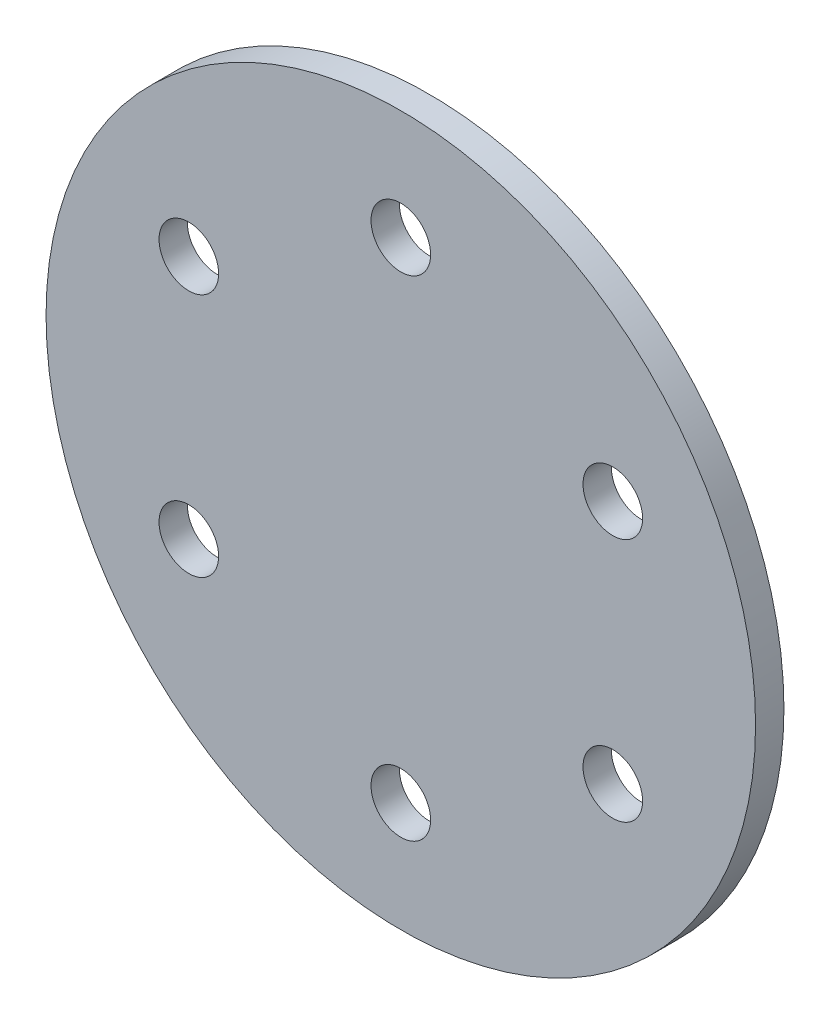
ISO-10303-21;
HEADER;
FILE_DESCRIPTION(('STEP AP214'),'2;1');
FILE_NAME('part.step','',(''),(''),'','','');
FILE_SCHEMA(('AUTOMOTIVE_DESIGN { 1 0 10303 214 1 1 1 1 }'));
ENDSEC;
DATA;
#1=APPLICATION_CONTEXT('core data for automotive mechanical design processes');
#2=APPLICATION_PROTOCOL_DEFINITION('international standard','automotive_design',2000,#1);
#3=PRODUCT_CONTEXT('',#1,'mechanical');
#4=PRODUCT('Part','Part','',(#3));
#5=PRODUCT_RELATED_PRODUCT_CATEGORY('part','',(#4));
#6=PRODUCT_DEFINITION_FORMATION('','',#4);
#7=PRODUCT_DEFINITION_CONTEXT('part definition',#1,'design');
#8=PRODUCT_DEFINITION('design','',#6,#7);
#9=PRODUCT_DEFINITION_SHAPE('','',#8);
#10=(LENGTH_UNIT() NAMED_UNIT(*) SI_UNIT(.MILLI.,.METRE.));
#11=(NAMED_UNIT(*) PLANE_ANGLE_UNIT() SI_UNIT($,.RADIAN.));
#12=(NAMED_UNIT(*) SI_UNIT($,.STERADIAN.) SOLID_ANGLE_UNIT());
#13=UNCERTAINTY_MEASURE_WITH_UNIT(LENGTH_MEASURE(1.E-05),#10,'distance_accuracy_value','');
#14=(GEOMETRIC_REPRESENTATION_CONTEXT(3) GLOBAL_UNCERTAINTY_ASSIGNED_CONTEXT((#13)) GLOBAL_UNIT_ASSIGNED_CONTEXT((#10,
#11,#12)) REPRESENTATION_CONTEXT('',''));
#15=CARTESIAN_POINT('',(0.,0.,0.));
#16=DIRECTION('',(0.,0.,1.));
#17=DIRECTION('',(1.,0.,0.));
#18=AXIS2_PLACEMENT_3D('',#15,#16,#17);
#19=CARTESIAN_POINT('',(0.,0.,2.));
#20=DIRECTION('',(0.,0.,1.));
#21=DIRECTION('',(1.,0.,0.));
#22=AXIS2_PLACEMENT_3D('',#19,#20,#21);
#23=PLANE('',#22);
#24=CARTESIAN_POINT('',(-14.9389382152805,-8.62500000000064,2.));
#25=DIRECTION('',(0.,0.,1.));
#26=DIRECTION('',(1.,0.,0.));
#27=AXIS2_PLACEMENT_3D('',#24,#25,#26);
#28=CIRCLE('',#27,2.1);
#29=CARTESIAN_POINT('',(-12.8389382152805,-8.62500000000064,2.));
#30=VERTEX_POINT('',#29);
#31=EDGE_CURVE('E69',#30,#30,#28,.T.);
#32=ORIENTED_EDGE('',*,*,#31,.F.);
#33=EDGE_LOOP('',(#32));
#34=FACE_BOUND('',#33,.T.);
#35=CARTESIAN_POINT('',(14.9389382152827,-8.62499999999937,2.));
#36=DIRECTION('',(0.,0.,1.));
#37=DIRECTION('',(1.,0.,0.));
#38=AXIS2_PLACEMENT_3D('',#35,#36,#37);
#39=CIRCLE('',#38,2.1);
#40=CARTESIAN_POINT('',(17.0389382152827,-8.62499999999937,2.));
#41=VERTEX_POINT('',#40);
#42=EDGE_CURVE('E57',#41,#41,#39,.T.);
#43=ORIENTED_EDGE('',*,*,#42,.F.);
#44=EDGE_LOOP('',(#43));
#45=FACE_BOUND('',#44,.T.);
#46=CARTESIAN_POINT('',(0.,17.25,2.));
#47=DIRECTION('',(0.,0.,1.));
#48=DIRECTION('',(1.,0.,0.));
#49=AXIS2_PLACEMENT_3D('',#46,#47,#48);
#50=CIRCLE('',#49,2.1);
#51=CARTESIAN_POINT('',(2.1,17.25,2.));
#52=VERTEX_POINT('',#51);
#53=EDGE_CURVE('E46',#52,#52,#50,.T.);
#54=ORIENTED_EDGE('',*,*,#53,.F.);
#55=EDGE_LOOP('',(#54));
#56=FACE_BOUND('',#55,.T.);
#57=CARTESIAN_POINT('',(0.,0.,2.));
#58=DIRECTION('',(0.,0.,1.));
#59=DIRECTION('',(1.,0.,0.));
#60=AXIS2_PLACEMENT_3D('',#57,#58,#59);
#61=CIRCLE('',#60,25.);
#62=CARTESIAN_POINT('',(25.,0.,2.));
#63=VERTEX_POINT('',#62);
#64=EDGE_CURVE('E10',#63,#63,#61,.T.);
#65=ORIENTED_EDGE('',*,*,#64,.T.);
#66=EDGE_LOOP('',(#65));
#67=FACE_BOUND('',#66,.T.);
#68=CARTESIAN_POINT('',(14.9389382152819,8.62500000000064,2.));
#69=DIRECTION('',(0.,0.,1.));
#70=DIRECTION('',(1.,0.,0.));
#71=AXIS2_PLACEMENT_3D('',#68,#69,#70);
#72=CIRCLE('',#71,2.1);
#73=CARTESIAN_POINT('',(17.0389382152819,8.62500000000064,2.));
#74=VERTEX_POINT('',#73);
#75=EDGE_CURVE('E51',#74,#74,#72,.T.);
#76=ORIENTED_EDGE('',*,*,#75,.F.);
#77=EDGE_LOOP('',(#76));
#78=FACE_BOUND('',#77,.T.);
#79=CARTESIAN_POINT('',(1.46448591583782E-12,-17.25,2.));
#80=DIRECTION('',(0.,0.,1.));
#81=DIRECTION('',(1.,0.,0.));
#82=AXIS2_PLACEMENT_3D('',#79,#80,#81);
#83=CIRCLE('',#82,2.1);
#84=CARTESIAN_POINT('',(2.10000000000147,-17.25,2.));
#85=VERTEX_POINT('',#84);
#86=EDGE_CURVE('E63',#85,#85,#83,.T.);
#87=ORIENTED_EDGE('',*,*,#86,.F.);
#88=EDGE_LOOP('',(#87));
#89=FACE_BOUND('',#88,.T.);
#90=CARTESIAN_POINT('',(-14.9389382152812,8.62499999999936,2.));
#91=DIRECTION('',(0.,0.,1.));
#92=DIRECTION('',(1.,0.,0.));
#93=AXIS2_PLACEMENT_3D('',#90,#91,#92);
#94=CIRCLE('',#93,2.1);
#95=CARTESIAN_POINT('',(-12.8389382152812,8.62499999999936,2.));
#96=VERTEX_POINT('',#95);
#97=EDGE_CURVE('E75',#96,#96,#94,.T.);
#98=ORIENTED_EDGE('',*,*,#97,.F.);
#99=EDGE_LOOP('',(#98));
#100=FACE_BOUND('',#99,.T.);
#101=ADVANCED_FACE('F35',(#34,#45,#56,#67,#78,#89,#100),#23,.T.);
#102=CARTESIAN_POINT('',(0.,0.,0.));
#103=DIRECTION('',(0.,0.,1.));
#104=DIRECTION('',(1.,0.,0.));
#105=AXIS2_PLACEMENT_3D('',#102,#103,#104);
#106=PLANE('',#105);
#107=CARTESIAN_POINT('',(0.,0.,0.));
#108=DIRECTION('',(0.,0.,1.));
#109=DIRECTION('',(1.,0.,0.));
#110=AXIS2_PLACEMENT_3D('',#107,#108,#109);
#111=CIRCLE('',#110,25.);
#112=CARTESIAN_POINT('',(25.,0.,0.));
#113=VERTEX_POINT('',#112);
#114=EDGE_CURVE('E39',#113,#113,#111,.T.);
#115=ORIENTED_EDGE('',*,*,#114,.F.);
#116=EDGE_LOOP('',(#115));
#117=FACE_BOUND('',#116,.T.);
#118=CARTESIAN_POINT('',(0.,17.25,0.));
#119=DIRECTION('',(0.,0.,1.));
#120=DIRECTION('',(1.,0.,0.));
#121=AXIS2_PLACEMENT_3D('',#118,#119,#120);
#122=CIRCLE('',#121,2.1);
#123=CARTESIAN_POINT('',(2.1,17.25,0.));
#124=VERTEX_POINT('',#123);
#125=EDGE_CURVE('E48',#124,#124,#122,.T.);
#126=ORIENTED_EDGE('',*,*,#125,.T.);
#127=EDGE_LOOP('',(#126));
#128=FACE_BOUND('',#127,.T.);
#129=CARTESIAN_POINT('',(14.9389382152819,8.62500000000064,0.));
#130=DIRECTION('',(0.,0.,1.));
#131=DIRECTION('',(1.,0.,0.));
#132=AXIS2_PLACEMENT_3D('',#129,#130,#131);
#133=CIRCLE('',#132,2.1);
#134=CARTESIAN_POINT('',(17.0389382152819,8.62500000000064,0.));
#135=VERTEX_POINT('',#134);
#136=EDGE_CURVE('E54',#135,#135,#133,.T.);
#137=ORIENTED_EDGE('',*,*,#136,.T.);
#138=EDGE_LOOP('',(#137));
#139=FACE_BOUND('',#138,.T.);
#140=CARTESIAN_POINT('',(14.9389382152827,-8.62499999999937,0.));
#141=DIRECTION('',(0.,0.,1.));
#142=DIRECTION('',(1.,0.,0.));
#143=AXIS2_PLACEMENT_3D('',#140,#141,#142);
#144=CIRCLE('',#143,2.1);
#145=CARTESIAN_POINT('',(17.0389382152827,-8.62499999999937,0.));
#146=VERTEX_POINT('',#145);
#147=EDGE_CURVE('E60',#146,#146,#144,.T.);
#148=ORIENTED_EDGE('',*,*,#147,.T.);
#149=EDGE_LOOP('',(#148));
#150=FACE_BOUND('',#149,.T.);
#151=CARTESIAN_POINT('',(1.46448591583782E-12,-17.25,0.));
#152=DIRECTION('',(0.,0.,1.));
#153=DIRECTION('',(1.,0.,0.));
#154=AXIS2_PLACEMENT_3D('',#151,#152,#153);
#155=CIRCLE('',#154,2.1);
#156=CARTESIAN_POINT('',(2.10000000000147,-17.25,0.));
#157=VERTEX_POINT('',#156);
#158=EDGE_CURVE('E66',#157,#157,#155,.T.);
#159=ORIENTED_EDGE('',*,*,#158,.T.);
#160=EDGE_LOOP('',(#159));
#161=FACE_BOUND('',#160,.T.);
#162=CARTESIAN_POINT('',(-14.9389382152805,-8.62500000000064,0.));
#163=DIRECTION('',(0.,0.,1.));
#164=DIRECTION('',(1.,0.,0.));
#165=AXIS2_PLACEMENT_3D('',#162,#163,#164);
#166=CIRCLE('',#165,2.1);
#167=CARTESIAN_POINT('',(-12.8389382152805,-8.62500000000064,0.));
#168=VERTEX_POINT('',#167);
#169=EDGE_CURVE('E72',#168,#168,#166,.T.);
#170=ORIENTED_EDGE('',*,*,#169,.T.);
#171=EDGE_LOOP('',(#170));
#172=FACE_BOUND('',#171,.T.);
#173=CARTESIAN_POINT('',(-14.9389382152812,8.62499999999936,0.));
#174=DIRECTION('',(0.,0.,1.));
#175=DIRECTION('',(1.,0.,0.));
#176=AXIS2_PLACEMENT_3D('',#173,#174,#175);
#177=CIRCLE('',#176,2.1);
#178=CARTESIAN_POINT('',(-12.8389382152812,8.62499999999936,0.));
#179=VERTEX_POINT('',#178);
#180=EDGE_CURVE('E78',#179,#179,#177,.T.);
#181=ORIENTED_EDGE('',*,*,#180,.T.);
#182=EDGE_LOOP('',(#181));
#183=FACE_BOUND('',#182,.T.);
#184=ADVANCED_FACE('F88',(#117,#128,#139,#150,#161,#172,#183),#106,.F.);
#185=CARTESIAN_POINT('',(0.,0.,2.));
#186=DIRECTION('',(0.,0.,-1.));
#187=DIRECTION('',(-1.,0.,0.));
#188=AXIS2_PLACEMENT_3D('',#185,#186,#187);
#189=CYLINDRICAL_SURFACE('',#188,25.);
#190=ORIENTED_EDGE('',*,*,#64,.F.);
#191=EDGE_LOOP('',(#190));
#192=FACE_BOUND('',#191,.T.);
#193=ORIENTED_EDGE('',*,*,#114,.T.);
#194=EDGE_LOOP('',(#193));
#195=FACE_BOUND('',#194,.T.);
#196=ADVANCED_FACE('F37',(#192,#195),#189,.T.);
#197=CARTESIAN_POINT('',(0.,17.25,2.));
#198=DIRECTION('',(0.,0.,-1.));
#199=DIRECTION('',(-1.,0.,0.));
#200=AXIS2_PLACEMENT_3D('',#197,#198,#199);
#201=CYLINDRICAL_SURFACE('',#200,2.1);
#202=ORIENTED_EDGE('',*,*,#53,.T.);
#203=EDGE_LOOP('',(#202));
#204=FACE_BOUND('',#203,.T.);
#205=ORIENTED_EDGE('',*,*,#125,.F.);
#206=EDGE_LOOP('',(#205));
#207=FACE_BOUND('',#206,.T.);
#208=ADVANCED_FACE('F98',(#204,#207),#201,.F.);
#209=CARTESIAN_POINT('',(14.9389382152819,8.62500000000064,2.));
#210=DIRECTION('',(0.,0.,-1.));
#211=DIRECTION('',(-1.,0.,0.));
#212=AXIS2_PLACEMENT_3D('',#209,#210,#211);
#213=CYLINDRICAL_SURFACE('',#212,2.1);
#214=ORIENTED_EDGE('',*,*,#75,.T.);
#215=EDGE_LOOP('',(#214));
#216=FACE_BOUND('',#215,.T.);
#217=ORIENTED_EDGE('',*,*,#136,.F.);
#218=EDGE_LOOP('',(#217));
#219=FACE_BOUND('',#218,.T.);
#220=ADVANCED_FACE('F101',(#216,#219),#213,.F.);
#221=CARTESIAN_POINT('',(14.9389382152827,-8.62499999999937,2.));
#222=DIRECTION('',(0.,0.,-1.));
#223=DIRECTION('',(-1.,0.,0.));
#224=AXIS2_PLACEMENT_3D('',#221,#222,#223);
#225=CYLINDRICAL_SURFACE('',#224,2.1);
#226=ORIENTED_EDGE('',*,*,#42,.T.);
#227=EDGE_LOOP('',(#226));
#228=FACE_BOUND('',#227,.T.);
#229=ORIENTED_EDGE('',*,*,#147,.F.);
#230=EDGE_LOOP('',(#229));
#231=FACE_BOUND('',#230,.T.);
#232=ADVANCED_FACE('F105',(#228,#231),#225,.F.);
#233=CARTESIAN_POINT('',(1.46448591583782E-12,-17.25,2.));
#234=DIRECTION('',(0.,0.,-1.));
#235=DIRECTION('',(-1.,0.,0.));
#236=AXIS2_PLACEMENT_3D('',#233,#234,#235);
#237=CYLINDRICAL_SURFACE('',#236,2.1);
#238=ORIENTED_EDGE('',*,*,#86,.T.);
#239=EDGE_LOOP('',(#238));
#240=FACE_BOUND('',#239,.T.);
#241=ORIENTED_EDGE('',*,*,#158,.F.);
#242=EDGE_LOOP('',(#241));
#243=FACE_BOUND('',#242,.T.);
#244=ADVANCED_FACE('F109',(#240,#243),#237,.F.);
#245=CARTESIAN_POINT('',(-14.9389382152805,-8.62500000000064,2.));
#246=DIRECTION('',(0.,0.,-1.));
#247=DIRECTION('',(-1.,0.,0.));
#248=AXIS2_PLACEMENT_3D('',#245,#246,#247);
#249=CYLINDRICAL_SURFACE('',#248,2.1);
#250=ORIENTED_EDGE('',*,*,#31,.T.);
#251=EDGE_LOOP('',(#250));
#252=FACE_BOUND('',#251,.T.);
#253=ORIENTED_EDGE('',*,*,#169,.F.);
#254=EDGE_LOOP('',(#253));
#255=FACE_BOUND('',#254,.T.);
#256=ADVANCED_FACE('F113',(#252,#255),#249,.F.);
#257=CARTESIAN_POINT('',(-14.9389382152812,8.62499999999936,2.));
#258=DIRECTION('',(0.,0.,-1.));
#259=DIRECTION('',(-1.,0.,0.));
#260=AXIS2_PLACEMENT_3D('',#257,#258,#259);
#261=CYLINDRICAL_SURFACE('',#260,2.1);
#262=ORIENTED_EDGE('',*,*,#97,.T.);
#263=EDGE_LOOP('',(#262));
#264=FACE_BOUND('',#263,.T.);
#265=ORIENTED_EDGE('',*,*,#180,.F.);
#266=EDGE_LOOP('',(#265));
#267=FACE_BOUND('',#266,.T.);
#268=ADVANCED_FACE('F84',(#264,#267),#261,.F.);
#269=CLOSED_SHELL('',(#101,#184,#196,#208,#220,#232,#244,#256,#268));
#270=MANIFOLD_SOLID_BREP('B2',#269);
#271=ADVANCED_BREP_SHAPE_REPRESENTATION('',(#18,#270),#14);
#272=SHAPE_DEFINITION_REPRESENTATION(#9,#271);
ENDSEC;
END-ISO-10303-21;
